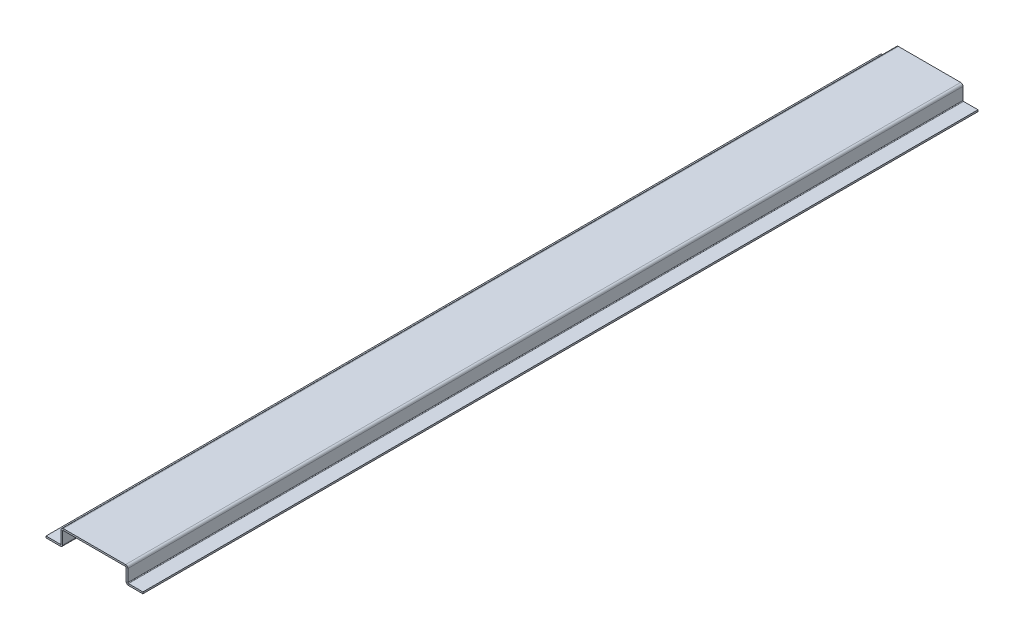
ISO-10303-21;
HEADER;
FILE_DESCRIPTION(('STEP AP214'),'2;1');
FILE_NAME('part.step','',(''),(''),'','','');
FILE_SCHEMA(('AUTOMOTIVE_DESIGN { 1 0 10303 214 1 1 1 1 }'));
ENDSEC;
DATA;
#1=APPLICATION_CONTEXT('core data for automotive mechanical design processes');
#2=APPLICATION_PROTOCOL_DEFINITION('international standard','automotive_design',2000,#1);
#3=PRODUCT_CONTEXT('',#1,'mechanical');
#4=PRODUCT('Part','Part','',(#3));
#5=PRODUCT_RELATED_PRODUCT_CATEGORY('part','',(#4));
#6=PRODUCT_DEFINITION_FORMATION('','',#4);
#7=PRODUCT_DEFINITION_CONTEXT('part definition',#1,'design');
#8=PRODUCT_DEFINITION('design','',#6,#7);
#9=PRODUCT_DEFINITION_SHAPE('','',#8);
#10=(LENGTH_UNIT() NAMED_UNIT(*) SI_UNIT(.MILLI.,.METRE.));
#11=(NAMED_UNIT(*) PLANE_ANGLE_UNIT() SI_UNIT($,.RADIAN.));
#12=(NAMED_UNIT(*) SI_UNIT($,.STERADIAN.) SOLID_ANGLE_UNIT());
#13=UNCERTAINTY_MEASURE_WITH_UNIT(LENGTH_MEASURE(1.E-05),#10,'distance_accuracy_value','');
#14=(GEOMETRIC_REPRESENTATION_CONTEXT(3) GLOBAL_UNCERTAINTY_ASSIGNED_CONTEXT((#13)) GLOBAL_UNIT_ASSIGNED_CONTEXT((#10,
#11,#12)) REPRESENTATION_CONTEXT('',''));
#15=CARTESIAN_POINT('',(0.,0.,0.));
#16=DIRECTION('',(0.,0.,1.));
#17=DIRECTION('',(1.,0.,0.));
#18=AXIS2_PLACEMENT_3D('',#15,#16,#17);
#19=CARTESIAN_POINT('',(40.7366,-18.,-1000.));
#20=DIRECTION('',(0.,0.,-1.));
#21=DIRECTION('',(-1.,0.,0.));
#22=AXIS2_PLACEMENT_3D('',#19,#20,#21);
#23=PLANE('',#22);
#24=DIRECTION('',(0.,1.,0.));
#25=VECTOR('',#24,1.);
#26=CARTESIAN_POINT('',(40.7366,-18.,-1000.));
#27=LINE('',#26,#25);
#28=CARTESIAN_POINT('',(40.7366,-18.,-1000.));
#29=VERTEX_POINT('',#28);
#30=CARTESIAN_POINT('',(40.7366,-16.,-1000.));
#31=VERTEX_POINT('',#30);
#32=EDGE_CURVE('E11',#29,#31,#27,.T.);
#33=ORIENTED_EDGE('',*,*,#32,.F.);
#34=CARTESIAN_POINT('',(40.7366,-15.2634,-1000.));
#35=DIRECTION('',(0.,0.,1.));
#36=DIRECTION('',(1.,0.,0.));
#37=AXIS2_PLACEMENT_3D('',#34,#35,#36);
#38=CIRCLE('',#37,2.7366);
#39=CARTESIAN_POINT('',(38.,-15.2634,-1000.));
#40=VERTEX_POINT('',#39);
#41=EDGE_CURVE('E368',#29,#40,#38,.F.);
#42=ORIENTED_EDGE('',*,*,#41,.T.);
#43=DIRECTION('',(-1.,0.,0.));
#44=VECTOR('',#43,1.);
#45=CARTESIAN_POINT('',(40.,-15.2634,-1000.));
#46=LINE('',#45,#44);
#47=CARTESIAN_POINT('',(40.,-15.2634,-1000.));
#48=VERTEX_POINT('',#47);
#49=EDGE_CURVE('E45',#48,#40,#46,.T.);
#50=ORIENTED_EDGE('',*,*,#49,.F.);
#51=CARTESIAN_POINT('',(40.7366,-15.2634,-1000.));
#52=DIRECTION('',(0.,0.,1.));
#53=DIRECTION('',(1.,0.,0.));
#54=AXIS2_PLACEMENT_3D('',#51,#52,#53);
#55=CIRCLE('',#54,0.7366);
#56=EDGE_CURVE('E393',#31,#48,#55,.F.);
#57=ORIENTED_EDGE('',*,*,#56,.F.);
#58=EDGE_LOOP('',(#33,#42,#50,#57));
#59=FACE_BOUND('',#58,.T.);
#60=ADVANCED_FACE('F37',(#59),#23,.T.);
#61=CARTESIAN_POINT('',(40.,-15.2634,-1000.));
#62=DIRECTION('',(0.,0.,-1.));
#63=DIRECTION('',(-1.,0.,0.));
#64=AXIS2_PLACEMENT_3D('',#61,#62,#63);
#65=PLANE('',#64);
#66=DIRECTION('',(-1.,0.,0.));
#67=VECTOR('',#66,1.);
#68=CARTESIAN_POINT('',(38.,-18.,-1000.));
#69=LINE('',#68,#67);
#70=CARTESIAN_POINT('',(58.,-18.,-1000.));
#71=VERTEX_POINT('',#70);
#72=EDGE_CURVE('E372',#71,#29,#69,.T.);
#73=ORIENTED_EDGE('',*,*,#72,.T.);
#74=ORIENTED_EDGE('',*,*,#32,.T.);
#75=DIRECTION('',(-1.,0.,0.));
#76=VECTOR('',#75,1.);
#77=CARTESIAN_POINT('',(38.,-16.,-1000.));
#78=LINE('',#77,#76);
#79=CARTESIAN_POINT('',(58.,-16.,-1000.));
#80=VERTEX_POINT('',#79);
#81=EDGE_CURVE('E390',#80,#31,#78,.T.);
#82=ORIENTED_EDGE('',*,*,#81,.F.);
#83=DIRECTION('',(0.,-1.,0.));
#84=VECTOR('',#83,1.);
#85=CARTESIAN_POINT('',(58.,-16.,-1000.));
#86=LINE('',#85,#84);
#87=EDGE_CURVE('E388',#80,#71,#86,.T.);
#88=ORIENTED_EDGE('',*,*,#87,.T.);
#89=EDGE_LOOP('',(#73,#74,#82,#88));
#90=FACE_BOUND('',#89,.T.);
#91=ADVANCED_FACE('F418',(#90),#65,.T.);
#92=CARTESIAN_POINT('',(38.,-15.2634,0.));
#93=DIRECTION('',(0.,0.,1.));
#94=DIRECTION('',(1.,0.,0.));
#95=AXIS2_PLACEMENT_3D('',#92,#93,#94);
#96=PLANE('',#95);
#97=DIRECTION('',(1.,0.,0.));
#98=VECTOR('',#97,1.);
#99=CARTESIAN_POINT('',(38.,-15.2634,0.));
#100=LINE('',#99,#98);
#101=CARTESIAN_POINT('',(38.,-15.2634,0.));
#102=VERTEX_POINT('',#101);
#103=CARTESIAN_POINT('',(40.,-15.2634,0.));
#104=VERTEX_POINT('',#103);
#105=EDGE_CURVE('E352',#102,#104,#100,.T.);
#106=ORIENTED_EDGE('',*,*,#105,.F.);
#107=CARTESIAN_POINT('',(40.7366,-15.2634,0.));
#108=DIRECTION('',(0.,0.,1.));
#109=DIRECTION('',(1.,0.,0.));
#110=AXIS2_PLACEMENT_3D('',#107,#108,#109);
#111=CIRCLE('',#110,2.7366);
#112=CARTESIAN_POINT('',(40.7366,-18.,0.));
#113=VERTEX_POINT('',#112);
#114=EDGE_CURVE('E256',#113,#102,#111,.F.);
#115=ORIENTED_EDGE('',*,*,#114,.F.);
#116=DIRECTION('',(0.,-1.,0.));
#117=VECTOR('',#116,1.);
#118=CARTESIAN_POINT('',(40.7366,-16.,0.));
#119=LINE('',#118,#117);
#120=CARTESIAN_POINT('',(40.7366,-16.,0.));
#121=VERTEX_POINT('',#120);
#122=EDGE_CURVE('E350',#121,#113,#119,.T.);
#123=ORIENTED_EDGE('',*,*,#122,.F.);
#124=CARTESIAN_POINT('',(40.7366,-15.2634,0.));
#125=DIRECTION('',(0.,0.,1.));
#126=DIRECTION('',(1.,0.,0.));
#127=AXIS2_PLACEMENT_3D('',#124,#125,#126);
#128=CIRCLE('',#127,0.7366);
#129=EDGE_CURVE('E267',#121,#104,#128,.F.);
#130=ORIENTED_EDGE('',*,*,#129,.T.);
#131=EDGE_LOOP('',(#106,#115,#123,#130));
#132=FACE_BOUND('',#131,.T.);
#133=ADVANCED_FACE('F426',(#132),#96,.T.);
#134=CARTESIAN_POINT('',(40.7366,-16.,0.));
#135=DIRECTION('',(0.,0.,1.));
#136=DIRECTION('',(1.,0.,0.));
#137=AXIS2_PLACEMENT_3D('',#134,#135,#136);
#138=PLANE('',#137);
#139=DIRECTION('',(0.,1.,0.));
#140=VECTOR('',#139,1.);
#141=CARTESIAN_POINT('',(38.,0.,0.));
#142=LINE('',#141,#140);
#143=CARTESIAN_POINT('',(38.,-0.7366,0.));
#144=VERTEX_POINT('',#143);
#145=EDGE_CURVE('E253',#102,#144,#142,.T.);
#146=ORIENTED_EDGE('',*,*,#145,.F.);
#147=ORIENTED_EDGE('',*,*,#105,.T.);
#148=DIRECTION('',(0.,1.,0.));
#149=VECTOR('',#148,1.);
#150=CARTESIAN_POINT('',(40.,0.,0.));
#151=LINE('',#150,#149);
#152=CARTESIAN_POINT('',(40.,-0.7366,0.));
#153=VERTEX_POINT('',#152);
#154=EDGE_CURVE('E270',#104,#153,#151,.T.);
#155=ORIENTED_EDGE('',*,*,#154,.T.);
#156=DIRECTION('',(-1.,0.,0.));
#157=VECTOR('',#156,1.);
#158=CARTESIAN_POINT('',(40.,-0.7366,0.));
#159=LINE('',#158,#157);
#160=EDGE_CURVE('E342',#153,#144,#159,.T.);
#161=ORIENTED_EDGE('',*,*,#160,.T.);
#162=EDGE_LOOP('',(#146,#147,#155,#161));
#163=FACE_BOUND('',#162,.T.);
#164=ADVANCED_FACE('F428',(#163),#138,.T.);
#165=CARTESIAN_POINT('',(38.,-0.7366,-1000.));
#166=DIRECTION('',(0.,0.,-1.));
#167=DIRECTION('',(-1.,0.,0.));
#168=AXIS2_PLACEMENT_3D('',#165,#166,#167);
#169=PLANE('',#168);
#170=DIRECTION('',(1.,0.,0.));
#171=VECTOR('',#170,1.);
#172=CARTESIAN_POINT('',(38.,-0.7366,-1000.));
#173=LINE('',#172,#171);
#174=CARTESIAN_POINT('',(38.,-0.7366,-1000.));
#175=VERTEX_POINT('',#174);
#176=CARTESIAN_POINT('',(40.,-0.7366,-1000.));
#177=VERTEX_POINT('',#176);
#178=EDGE_CURVE('E348',#175,#177,#173,.T.);
#179=ORIENTED_EDGE('',*,*,#178,.F.);
#180=CARTESIAN_POINT('',(37.2634,-0.7366,-1000.));
#181=DIRECTION('',(0.,0.,-1.));
#182=DIRECTION('',(-1.,0.,0.));
#183=AXIS2_PLACEMENT_3D('',#180,#181,#182);
#184=CIRCLE('',#183,0.7366);
#185=CARTESIAN_POINT('',(37.2634,0.,-1000.));
#186=VERTEX_POINT('',#185);
#187=EDGE_CURVE('E380',#175,#186,#184,.F.);
#188=ORIENTED_EDGE('',*,*,#187,.T.);
#189=DIRECTION('',(0.,-1.,0.));
#190=VECTOR('',#189,1.);
#191=CARTESIAN_POINT('',(37.2634,2.,-1000.));
#192=LINE('',#191,#190);
#193=CARTESIAN_POINT('',(37.2634,2.,-1000.));
#194=VERTEX_POINT('',#193);
#195=EDGE_CURVE('E346',#194,#186,#192,.T.);
#196=ORIENTED_EDGE('',*,*,#195,.F.);
#197=CARTESIAN_POINT('',(37.2634,-0.7366,-1000.));
#198=DIRECTION('',(0.,0.,1.));
#199=DIRECTION('',(1.,0.,0.));
#200=AXIS2_PLACEMENT_3D('',#197,#198,#199);
#201=CIRCLE('',#200,2.7366);
#202=EDGE_CURVE('E224',#177,#194,#201,.T.);
#203=ORIENTED_EDGE('',*,*,#202,.F.);
#204=EDGE_LOOP('',(#179,#188,#196,#203));
#205=FACE_BOUND('',#204,.T.);
#206=ADVANCED_FACE('F404',(#205),#169,.T.);
#207=CARTESIAN_POINT('',(37.2634,2.,-1000.));
#208=DIRECTION('',(0.,0.,-1.));
#209=DIRECTION('',(-1.,0.,0.));
#210=AXIS2_PLACEMENT_3D('',#207,#208,#209);
#211=PLANE('',#210);
#212=DIRECTION('',(0.,1.,0.));
#213=VECTOR('',#212,1.);
#214=CARTESIAN_POINT('',(38.,0.,-1000.));
#215=LINE('',#214,#213);
#216=EDGE_CURVE('E359',#40,#175,#215,.T.);
#217=ORIENTED_EDGE('',*,*,#216,.T.);
#218=ORIENTED_EDGE('',*,*,#178,.T.);
#219=DIRECTION('',(0.,1.,0.));
#220=VECTOR('',#219,1.);
#221=CARTESIAN_POINT('',(40.,0.,-1000.));
#222=LINE('',#221,#220);
#223=EDGE_CURVE('E362',#48,#177,#222,.T.);
#224=ORIENTED_EDGE('',*,*,#223,.F.);
#225=ORIENTED_EDGE('',*,*,#49,.T.);
#226=EDGE_LOOP('',(#217,#218,#224,#225));
#227=FACE_BOUND('',#226,.T.);
#228=ADVANCED_FACE('F357',(#227),#211,.T.);
#229=CARTESIAN_POINT('',(37.2634,0.,0.));
#230=DIRECTION('',(0.,0.,1.));
#231=DIRECTION('',(1.,0.,0.));
#232=AXIS2_PLACEMENT_3D('',#229,#230,#231);
#233=PLANE('',#232);
#234=DIRECTION('',(0.,1.,0.));
#235=VECTOR('',#234,1.);
#236=CARTESIAN_POINT('',(37.2634,0.,0.));
#237=LINE('',#236,#235);
#238=CARTESIAN_POINT('',(37.2634,0.,0.));
#239=VERTEX_POINT('',#238);
#240=CARTESIAN_POINT('',(37.2634,2.,0.));
#241=VERTEX_POINT('',#240);
#242=EDGE_CURVE('E344',#239,#241,#237,.T.);
#243=ORIENTED_EDGE('',*,*,#242,.F.);
#244=CARTESIAN_POINT('',(37.2634,-0.7366,0.));
#245=DIRECTION('',(0.,0.,-1.));
#246=DIRECTION('',(-1.,0.,0.));
#247=AXIS2_PLACEMENT_3D('',#244,#245,#246);
#248=CIRCLE('',#247,0.7366);
#249=EDGE_CURVE('E250',#144,#239,#248,.F.);
#250=ORIENTED_EDGE('',*,*,#249,.F.);
#251=ORIENTED_EDGE('',*,*,#160,.F.);
#252=CARTESIAN_POINT('',(37.2634,-0.7366,0.));
#253=DIRECTION('',(0.,0.,1.));
#254=DIRECTION('',(1.,0.,0.));
#255=AXIS2_PLACEMENT_3D('',#252,#253,#254);
#256=CIRCLE('',#255,2.7366);
#257=EDGE_CURVE('E273',#153,#241,#256,.T.);
#258=ORIENTED_EDGE('',*,*,#257,.T.);
#259=EDGE_LOOP('',(#243,#250,#251,#258));
#260=FACE_BOUND('',#259,.T.);
#261=ADVANCED_FACE('F434',(#260),#233,.T.);
#262=CARTESIAN_POINT('',(40.,-0.7366,0.));
#263=DIRECTION('',(0.,0.,1.));
#264=DIRECTION('',(1.,0.,0.));
#265=AXIS2_PLACEMENT_3D('',#262,#263,#264);
#266=PLANE('',#265);
#267=DIRECTION('',(-1.,0.,0.));
#268=VECTOR('',#267,1.);
#269=CARTESIAN_POINT('',(-38.,0.,0.));
#270=LINE('',#269,#268);
#271=CARTESIAN_POINT('',(-37.2634,0.,0.));
#272=VERTEX_POINT('',#271);
#273=EDGE_CURVE('E247',#239,#272,#270,.T.);
#274=ORIENTED_EDGE('',*,*,#273,.F.);
#275=ORIENTED_EDGE('',*,*,#242,.T.);
#276=DIRECTION('',(1.,0.,0.));
#277=VECTOR('',#276,1.);
#278=CARTESIAN_POINT('',(-38.,2.,0.));
#279=LINE('',#278,#277);
#280=CARTESIAN_POINT('',(-37.2634,2.,0.));
#281=VERTEX_POINT('',#280);
#282=EDGE_CURVE('E276',#241,#281,#279,.F.);
#283=ORIENTED_EDGE('',*,*,#282,.T.);
#284=DIRECTION('',(0.,-1.,0.));
#285=VECTOR('',#284,1.);
#286=CARTESIAN_POINT('',(-37.2634,2.,0.));
#287=LINE('',#286,#285);
#288=EDGE_CURVE('E338',#281,#272,#287,.T.);
#289=ORIENTED_EDGE('',*,*,#288,.T.);
#290=EDGE_LOOP('',(#274,#275,#283,#289));
#291=FACE_BOUND('',#290,.T.);
#292=ADVANCED_FACE('F437',(#291),#266,.T.);
#293=CARTESIAN_POINT('',(-37.2634,0.,-1000.));
#294=DIRECTION('',(0.,0.,-1.));
#295=DIRECTION('',(-1.,0.,0.));
#296=AXIS2_PLACEMENT_3D('',#293,#294,#295);
#297=PLANE('',#296);
#298=DIRECTION('',(0.,1.,0.));
#299=VECTOR('',#298,1.);
#300=CARTESIAN_POINT('',(-37.2634,0.,-1000.));
#301=LINE('',#300,#299);
#302=CARTESIAN_POINT('',(-37.2634,0.,-1000.));
#303=VERTEX_POINT('',#302);
#304=CARTESIAN_POINT('',(-37.2634,2.,-1000.));
#305=VERTEX_POINT('',#304);
#306=EDGE_CURVE('E196',#303,#305,#301,.T.);
#307=ORIENTED_EDGE('',*,*,#306,.F.);
#308=CARTESIAN_POINT('',(-37.2634,-0.7366,-1000.));
#309=DIRECTION('',(0.,0.,-1.));
#310=DIRECTION('',(-1.,0.,0.));
#311=AXIS2_PLACEMENT_3D('',#308,#309,#310);
#312=CIRCLE('',#311,0.7366);
#313=CARTESIAN_POINT('',(-38.,-0.7366,-1000.));
#314=VERTEX_POINT('',#313);
#315=EDGE_CURVE('E191',#303,#314,#312,.F.);
#316=ORIENTED_EDGE('',*,*,#315,.T.);
#317=DIRECTION('',(1.,0.,0.));
#318=VECTOR('',#317,1.);
#319=CARTESIAN_POINT('',(-40.,-0.736600000000001,-1000.));
#320=LINE('',#319,#318);
#321=CARTESIAN_POINT('',(-40.,-0.736600000000001,-1000.));
#322=VERTEX_POINT('',#321);
#323=EDGE_CURVE('E184',#322,#314,#320,.T.);
#324=ORIENTED_EDGE('',*,*,#323,.F.);
#325=CARTESIAN_POINT('',(-37.2634,-0.7366,-1000.));
#326=DIRECTION('',(0.,0.,1.));
#327=DIRECTION('',(1.,0.,0.));
#328=AXIS2_PLACEMENT_3D('',#325,#326,#327);
#329=CIRCLE('',#328,2.7366);
#330=EDGE_CURVE('E188',#305,#322,#329,.T.);
#331=ORIENTED_EDGE('',*,*,#330,.F.);
#332=EDGE_LOOP('',(#307,#316,#324,#331));
#333=FACE_BOUND('',#332,.T.);
#334=ADVANCED_FACE('F186',(#333),#297,.T.);
#335=CARTESIAN_POINT('',(-40.,-0.736600000000001,-1000.));
#336=DIRECTION('',(0.,0.,-1.));
#337=DIRECTION('',(-1.,0.,0.));
#338=AXIS2_PLACEMENT_3D('',#335,#336,#337);
#339=PLANE('',#338);
#340=DIRECTION('',(-1.,0.,0.));
#341=VECTOR('',#340,1.);
#342=CARTESIAN_POINT('',(-38.,0.,-1000.));
#343=LINE('',#342,#341);
#344=EDGE_CURVE('E383',#186,#303,#343,.T.);
#345=ORIENTED_EDGE('',*,*,#344,.T.);
#346=ORIENTED_EDGE('',*,*,#306,.T.);
#347=DIRECTION('',(1.,0.,0.));
#348=VECTOR('',#347,1.);
#349=CARTESIAN_POINT('',(-38.,2.,-1000.));
#350=LINE('',#349,#348);
#351=EDGE_CURVE('E222',#194,#305,#350,.F.);
#352=ORIENTED_EDGE('',*,*,#351,.F.);
#353=ORIENTED_EDGE('',*,*,#195,.T.);
#354=EDGE_LOOP('',(#345,#346,#352,#353));
#355=FACE_BOUND('',#354,.T.);
#356=ADVANCED_FACE('F485',(#355),#339,.T.);
#357=CARTESIAN_POINT('',(-38.,-0.7366,0.));
#358=DIRECTION('',(0.,0.,1.));
#359=DIRECTION('',(1.,0.,0.));
#360=AXIS2_PLACEMENT_3D('',#357,#358,#359);
#361=PLANE('',#360);
#362=DIRECTION('',(-1.,0.,0.));
#363=VECTOR('',#362,1.);
#364=CARTESIAN_POINT('',(-38.,-0.7366,0.));
#365=LINE('',#364,#363);
#366=CARTESIAN_POINT('',(-38.,-0.7366,0.));
#367=VERTEX_POINT('',#366);
#368=CARTESIAN_POINT('',(-40.,-0.736600000000001,0.));
#369=VERTEX_POINT('',#368);
#370=EDGE_CURVE('E197',#367,#369,#365,.T.);
#371=ORIENTED_EDGE('',*,*,#370,.F.);
#372=CARTESIAN_POINT('',(-37.2634,-0.7366,0.));
#373=DIRECTION('',(0.,0.,-1.));
#374=DIRECTION('',(-1.,0.,0.));
#375=AXIS2_PLACEMENT_3D('',#372,#373,#374);
#376=CIRCLE('',#375,0.7366);
#377=EDGE_CURVE('E244',#272,#367,#376,.F.);
#378=ORIENTED_EDGE('',*,*,#377,.F.);
#379=ORIENTED_EDGE('',*,*,#288,.F.);
#380=CARTESIAN_POINT('',(-37.2634,-0.7366,0.));
#381=DIRECTION('',(0.,0.,1.));
#382=DIRECTION('',(1.,0.,0.));
#383=AXIS2_PLACEMENT_3D('',#380,#381,#382);
#384=CIRCLE('',#383,2.7366);
#385=EDGE_CURVE('E279',#281,#369,#384,.T.);
#386=ORIENTED_EDGE('',*,*,#385,.T.);
#387=EDGE_LOOP('',(#371,#378,#379,#386));
#388=FACE_BOUND('',#387,.T.);
#389=ADVANCED_FACE('F446',(#388),#361,.T.);
#390=CARTESIAN_POINT('',(-37.2634,2.,0.));
#391=DIRECTION('',(0.,0.,1.));
#392=DIRECTION('',(1.,0.,0.));
#393=AXIS2_PLACEMENT_3D('',#390,#391,#392);
#394=PLANE('',#393);
#395=DIRECTION('',(0.,-1.,0.));
#396=VECTOR('',#395,1.);
#397=CARTESIAN_POINT('',(-38.,0.,0.));
#398=LINE('',#397,#396);
#399=CARTESIAN_POINT('',(-38.,-15.2634,0.));
#400=VERTEX_POINT('',#399);
#401=EDGE_CURVE('E241',#367,#400,#398,.T.);
#402=ORIENTED_EDGE('',*,*,#401,.F.);
#403=ORIENTED_EDGE('',*,*,#370,.T.);
#404=DIRECTION('',(0.,-1.,0.));
#405=VECTOR('',#404,1.);
#406=CARTESIAN_POINT('',(-40.,0.,0.));
#407=LINE('',#406,#405);
#408=CARTESIAN_POINT('',(-40.,-15.2634,0.));
#409=VERTEX_POINT('',#408);
#410=EDGE_CURVE('E207',#369,#409,#407,.T.);
#411=ORIENTED_EDGE('',*,*,#410,.T.);
#412=DIRECTION('',(1.,0.,0.));
#413=VECTOR('',#412,1.);
#414=CARTESIAN_POINT('',(-40.,-15.2634,0.));
#415=LINE('',#414,#413);
#416=EDGE_CURVE('E118',#409,#400,#415,.T.);
#417=ORIENTED_EDGE('',*,*,#416,.T.);
#418=EDGE_LOOP('',(#402,#403,#411,#417));
#419=FACE_BOUND('',#418,.T.);
#420=ADVANCED_FACE('F449',(#419),#394,.T.);
#421=CARTESIAN_POINT('',(-38.,-15.2634,-1000.));
#422=DIRECTION('',(0.,0.,-1.));
#423=DIRECTION('',(-1.,0.,0.));
#424=AXIS2_PLACEMENT_3D('',#421,#422,#423);
#425=PLANE('',#424);
#426=DIRECTION('',(-1.,0.,0.));
#427=VECTOR('',#426,1.);
#428=CARTESIAN_POINT('',(-38.,-15.2634,-1000.));
#429=LINE('',#428,#427);
#430=CARTESIAN_POINT('',(-38.,-15.2634,-1000.));
#431=VERTEX_POINT('',#430);
#432=CARTESIAN_POINT('',(-40.,-15.2634,-1000.));
#433=VERTEX_POINT('',#432);
#434=EDGE_CURVE('E215',#431,#433,#429,.T.);
#435=ORIENTED_EDGE('',*,*,#434,.F.);
#436=CARTESIAN_POINT('',(-40.7366,-15.2634,-1000.));
#437=DIRECTION('',(0.,0.,1.));
#438=DIRECTION('',(1.,0.,0.));
#439=AXIS2_PLACEMENT_3D('',#436,#437,#438);
#440=CIRCLE('',#439,2.7366);
#441=CARTESIAN_POINT('',(-40.7366,-18.,-1000.));
#442=VERTEX_POINT('',#441);
#443=EDGE_CURVE('E459',#431,#442,#440,.F.);
#444=ORIENTED_EDGE('',*,*,#443,.T.);
#445=DIRECTION('',(0.,-1.,0.));
#446=VECTOR('',#445,1.);
#447=CARTESIAN_POINT('',(-40.7366,-16.,-1000.));
#448=LINE('',#447,#446);
#449=CARTESIAN_POINT('',(-40.7366,-16.,-1000.));
#450=VERTEX_POINT('',#449);
#451=EDGE_CURVE('E53',#450,#442,#448,.T.);
#452=ORIENTED_EDGE('',*,*,#451,.F.);
#453=CARTESIAN_POINT('',(-40.7366,-15.2634,-1000.));
#454=DIRECTION('',(0.,0.,1.));
#455=DIRECTION('',(1.,0.,0.));
#456=AXIS2_PLACEMENT_3D('',#453,#454,#455);
#457=CIRCLE('',#456,0.7366);
#458=EDGE_CURVE('E217',#433,#450,#457,.F.);
#459=ORIENTED_EDGE('',*,*,#458,.F.);
#460=EDGE_LOOP('',(#435,#444,#452,#459));
#461=FACE_BOUND('',#460,.T.);
#462=ADVANCED_FACE('F524',(#461),#425,.T.);
#463=CARTESIAN_POINT('',(-40.7366,-16.,-1000.));
#464=DIRECTION('',(0.,0.,-1.));
#465=DIRECTION('',(-1.,0.,0.));
#466=AXIS2_PLACEMENT_3D('',#463,#464,#465);
#467=PLANE('',#466);
#468=DIRECTION('',(0.,-1.,0.));
#469=VECTOR('',#468,1.);
#470=CARTESIAN_POINT('',(-38.,0.,-1000.));
#471=LINE('',#470,#469);
#472=EDGE_CURVE('E477',#314,#431,#471,.T.);
#473=ORIENTED_EDGE('',*,*,#472,.T.);
#474=ORIENTED_EDGE('',*,*,#434,.T.);
#475=DIRECTION('',(0.,-1.,0.));
#476=VECTOR('',#475,1.);
#477=CARTESIAN_POINT('',(-40.,0.,-1000.));
#478=LINE('',#477,#476);
#479=EDGE_CURVE('E205',#322,#433,#478,.T.);
#480=ORIENTED_EDGE('',*,*,#479,.F.);
#481=ORIENTED_EDGE('',*,*,#323,.T.);
#482=EDGE_LOOP('',(#473,#474,#480,#481));
#483=FACE_BOUND('',#482,.T.);
#484=ADVANCED_FACE('F214',(#483),#467,.T.);
#485=CARTESIAN_POINT('',(-40.7366,-18.,0.));
#486=DIRECTION('',(0.,0.,1.));
#487=DIRECTION('',(1.,0.,0.));
#488=AXIS2_PLACEMENT_3D('',#485,#486,#487);
#489=PLANE('',#488);
#490=DIRECTION('',(0.,1.,0.));
#491=VECTOR('',#490,1.);
#492=CARTESIAN_POINT('',(-40.7366,-18.,0.));
#493=LINE('',#492,#491);
#494=CARTESIAN_POINT('',(-40.7366,-18.,0.));
#495=VERTEX_POINT('',#494);
#496=CARTESIAN_POINT('',(-40.7366,-16.,0.));
#497=VERTEX_POINT('',#496);
#498=EDGE_CURVE('E125',#495,#497,#493,.T.);
#499=ORIENTED_EDGE('',*,*,#498,.F.);
#500=CARTESIAN_POINT('',(-40.7366,-15.2634,0.));
#501=DIRECTION('',(0.,0.,1.));
#502=DIRECTION('',(1.,0.,0.));
#503=AXIS2_PLACEMENT_3D('',#500,#501,#502);
#504=CIRCLE('',#503,2.7366);
#505=EDGE_CURVE('E238',#400,#495,#504,.F.);
#506=ORIENTED_EDGE('',*,*,#505,.F.);
#507=ORIENTED_EDGE('',*,*,#416,.F.);
#508=CARTESIAN_POINT('',(-40.7366,-15.2634,0.));
#509=DIRECTION('',(0.,0.,1.));
#510=DIRECTION('',(1.,0.,0.));
#511=AXIS2_PLACEMENT_3D('',#508,#509,#510);
#512=CIRCLE('',#511,0.7366);
#513=EDGE_CURVE('E282',#409,#497,#512,.F.);
#514=ORIENTED_EDGE('',*,*,#513,.T.);
#515=EDGE_LOOP('',(#499,#506,#507,#514));
#516=FACE_BOUND('',#515,.T.);
#517=ADVANCED_FACE('F460',(#516),#489,.T.);
#518=CARTESIAN_POINT('',(-40.,-15.2634,0.));
#519=DIRECTION('',(0.,0.,1.));
#520=DIRECTION('',(1.,0.,0.));
#521=AXIS2_PLACEMENT_3D('',#518,#519,#520);
#522=PLANE('',#521);
#523=DIRECTION('',(-1.,0.,0.));
#524=VECTOR('',#523,1.);
#525=CARTESIAN_POINT('',(-38.,-18.,0.));
#526=LINE('',#525,#524);
#527=CARTESIAN_POINT('',(-58.,-18.,0.));
#528=VERTEX_POINT('',#527);
#529=EDGE_CURVE('E236',#495,#528,#526,.T.);
#530=ORIENTED_EDGE('',*,*,#529,.F.);
#531=ORIENTED_EDGE('',*,*,#498,.T.);
#532=DIRECTION('',(-1.,0.,0.));
#533=VECTOR('',#532,1.);
#534=CARTESIAN_POINT('',(-38.,-16.,0.));
#535=LINE('',#534,#533);
#536=CARTESIAN_POINT('',(-58.,-16.,0.));
#537=VERTEX_POINT('',#536);
#538=EDGE_CURVE('E231',#497,#537,#535,.T.);
#539=ORIENTED_EDGE('',*,*,#538,.T.);
#540=DIRECTION('',(0.,1.,0.));
#541=VECTOR('',#540,1.);
#542=CARTESIAN_POINT('',(-58.,-18.,0.));
#543=LINE('',#542,#541);
#544=EDGE_CURVE('E233',#528,#537,#543,.T.);
#545=ORIENTED_EDGE('',*,*,#544,.F.);
#546=EDGE_LOOP('',(#530,#531,#539,#545));
#547=FACE_BOUND('',#546,.T.);
#548=ADVANCED_FACE('F468',(#547),#522,.T.);
#549=CARTESIAN_POINT('',(-38.,-16.,-1000.));
#550=DIRECTION('',(0.,1.,0.));
#551=DIRECTION('',(-1.,0.,0.));
#552=AXIS2_PLACEMENT_3D('',#549,#550,#551);
#553=PLANE('',#552);
#554=ORIENTED_EDGE('',*,*,#538,.F.);
#555=DIRECTION('',(0.,0.,1.));
#556=VECTOR('',#555,1.);
#557=CARTESIAN_POINT('',(-40.7366,-16.,-1000.));
#558=LINE('',#557,#556);
#559=EDGE_CURVE('E285',#450,#497,#558,.T.);
#560=ORIENTED_EDGE('',*,*,#559,.F.);
#561=DIRECTION('',(-1.,0.,0.));
#562=VECTOR('',#561,1.);
#563=CARTESIAN_POINT('',(-38.,-16.,-1000.));
#564=LINE('',#563,#562);
#565=CARTESIAN_POINT('',(-58.,-16.,-1000.));
#566=VERTEX_POINT('',#565);
#567=EDGE_CURVE('E284',#450,#566,#564,.T.);
#568=ORIENTED_EDGE('',*,*,#567,.T.);
#569=DIRECTION('',(0.,0.,1.));
#570=VECTOR('',#569,1.);
#571=CARTESIAN_POINT('',(-58.,-16.,-1000.));
#572=LINE('',#571,#570);
#573=EDGE_CURVE('E230',#566,#537,#572,.T.);
#574=ORIENTED_EDGE('',*,*,#573,.T.);
#575=EDGE_LOOP('',(#554,#560,#568,#574));
#576=FACE_BOUND('',#575,.T.);
#577=ADVANCED_FACE('F466',(#576),#553,.T.);
#578=CARTESIAN_POINT('',(-40.7366,-15.2634,-1000.));
#579=DIRECTION('',(0.,0.,1.));
#580=DIRECTION('',(1.,0.,0.));
#581=AXIS2_PLACEMENT_3D('',#578,#579,#580);
#582=CYLINDRICAL_SURFACE('',#581,0.7366);
#583=ORIENTED_EDGE('',*,*,#513,.F.);
#584=DIRECTION('',(0.,0.,1.));
#585=VECTOR('',#584,1.);
#586=CARTESIAN_POINT('',(-40.,-15.2634,-1000.));
#587=LINE('',#586,#585);
#588=EDGE_CURVE('E211',#433,#409,#587,.T.);
#589=ORIENTED_EDGE('',*,*,#588,.F.);
#590=ORIENTED_EDGE('',*,*,#458,.T.);
#591=ORIENTED_EDGE('',*,*,#559,.T.);
#592=EDGE_LOOP('',(#583,#589,#590,#591));
#593=FACE_BOUND('',#592,.T.);
#594=ADVANCED_FACE('F462',(#593),#582,.F.);
#595=CARTESIAN_POINT('',(-40.,0.,-1000.));
#596=DIRECTION('',(-1.,0.,0.));
#597=DIRECTION('',(0.,-1.,0.));
#598=AXIS2_PLACEMENT_3D('',#595,#596,#597);
#599=PLANE('',#598);
#600=ORIENTED_EDGE('',*,*,#410,.F.);
#601=DIRECTION('',(0.,0.,1.));
#602=VECTOR('',#601,1.);
#603=CARTESIAN_POINT('',(-40.,-0.736600000000001,-1000.));
#604=LINE('',#603,#602);
#605=EDGE_CURVE('E203',#322,#369,#604,.T.);
#606=ORIENTED_EDGE('',*,*,#605,.F.);
#607=ORIENTED_EDGE('',*,*,#479,.T.);
#608=ORIENTED_EDGE('',*,*,#588,.T.);
#609=EDGE_LOOP('',(#600,#606,#607,#608));
#610=FACE_BOUND('',#609,.T.);
#611=ADVANCED_FACE('F204',(#610),#599,.T.);
#612=CARTESIAN_POINT('',(-37.2634,-0.7366,-1000.));
#613=DIRECTION('',(0.,0.,1.));
#614=DIRECTION('',(1.,0.,0.));
#615=AXIS2_PLACEMENT_3D('',#612,#613,#614);
#616=CYLINDRICAL_SURFACE('',#615,2.7366);
#617=ORIENTED_EDGE('',*,*,#385,.F.);
#618=DIRECTION('',(0.,0.,1.));
#619=VECTOR('',#618,1.);
#620=CARTESIAN_POINT('',(-37.2634,2.,-1000.));
#621=LINE('',#620,#619);
#622=EDGE_CURVE('E212',#305,#281,#621,.T.);
#623=ORIENTED_EDGE('',*,*,#622,.F.);
#624=ORIENTED_EDGE('',*,*,#330,.T.);
#625=ORIENTED_EDGE('',*,*,#605,.T.);
#626=EDGE_LOOP('',(#617,#623,#624,#625));
#627=FACE_BOUND('',#626,.T.);
#628=ADVANCED_FACE('F220',(#627),#616,.T.);
#629=CARTESIAN_POINT('',(-38.,2.,-1000.));
#630=DIRECTION('',(0.,1.,0.));
#631=DIRECTION('',(0.,0.,1.));
#632=AXIS2_PLACEMENT_3D('',#629,#630,#631);
#633=PLANE('',#632);
#634=ORIENTED_EDGE('',*,*,#282,.F.);
#635=DIRECTION('',(0.,0.,1.));
#636=VECTOR('',#635,1.);
#637=CARTESIAN_POINT('',(37.2634,2.,-1000.));
#638=LINE('',#637,#636);
#639=EDGE_CURVE('E289',#194,#241,#638,.T.);
#640=ORIENTED_EDGE('',*,*,#639,.F.);
#641=ORIENTED_EDGE('',*,*,#351,.T.);
#642=ORIENTED_EDGE('',*,*,#622,.T.);
#643=EDGE_LOOP('',(#634,#640,#641,#642));
#644=FACE_BOUND('',#643,.T.);
#645=ADVANCED_FACE('F488',(#644),#633,.T.);
#646=CARTESIAN_POINT('',(37.2634,-0.7366,-1000.));
#647=DIRECTION('',(0.,0.,1.));
#648=DIRECTION('',(1.,0.,0.));
#649=AXIS2_PLACEMENT_3D('',#646,#647,#648);
#650=CYLINDRICAL_SURFACE('',#649,2.7366);
#651=ORIENTED_EDGE('',*,*,#257,.F.);
#652=DIRECTION('',(0.,0.,1.));
#653=VECTOR('',#652,1.);
#654=CARTESIAN_POINT('',(40.,-0.7366,-1000.));
#655=LINE('',#654,#653);
#656=EDGE_CURVE('E292',#177,#153,#655,.T.);
#657=ORIENTED_EDGE('',*,*,#656,.F.);
#658=ORIENTED_EDGE('',*,*,#202,.T.);
#659=ORIENTED_EDGE('',*,*,#639,.T.);
#660=EDGE_LOOP('',(#651,#657,#658,#659));
#661=FACE_BOUND('',#660,.T.);
#662=ADVANCED_FACE('F400',(#661),#650,.T.);
#663=CARTESIAN_POINT('',(40.,0.,-1000.));
#664=DIRECTION('',(1.,0.,0.));
#665=DIRECTION('',(0.,1.,0.));
#666=AXIS2_PLACEMENT_3D('',#663,#664,#665);
#667=PLANE('',#666);
#668=ORIENTED_EDGE('',*,*,#154,.F.);
#669=DIRECTION('',(0.,0.,1.));
#670=VECTOR('',#669,1.);
#671=CARTESIAN_POINT('',(40.,-15.2634,-1000.));
#672=LINE('',#671,#670);
#673=EDGE_CURVE('E295',#48,#104,#672,.T.);
#674=ORIENTED_EDGE('',*,*,#673,.F.);
#675=ORIENTED_EDGE('',*,*,#223,.T.);
#676=ORIENTED_EDGE('',*,*,#656,.T.);
#677=EDGE_LOOP('',(#668,#674,#675,#676));
#678=FACE_BOUND('',#677,.T.);
#679=ADVANCED_FACE('F407',(#678),#667,.T.);
#680=CARTESIAN_POINT('',(40.7366,-15.2634,-1000.));
#681=DIRECTION('',(0.,0.,1.));
#682=DIRECTION('',(1.,0.,0.));
#683=AXIS2_PLACEMENT_3D('',#680,#681,#682);
#684=CYLINDRICAL_SURFACE('',#683,0.7366);
#685=ORIENTED_EDGE('',*,*,#129,.F.);
#686=DIRECTION('',(0.,0.,1.));
#687=VECTOR('',#686,1.);
#688=CARTESIAN_POINT('',(40.7366,-16.,-1000.));
#689=LINE('',#688,#687);
#690=EDGE_CURVE('E298',#31,#121,#689,.T.);
#691=ORIENTED_EDGE('',*,*,#690,.F.);
#692=ORIENTED_EDGE('',*,*,#56,.T.);
#693=ORIENTED_EDGE('',*,*,#673,.T.);
#694=EDGE_LOOP('',(#685,#691,#692,#693));
#695=FACE_BOUND('',#694,.T.);
#696=ADVANCED_FACE('F410',(#695),#684,.F.);
#697=CARTESIAN_POINT('',(38.,-16.,-1000.));
#698=DIRECTION('',(0.,1.,0.));
#699=DIRECTION('',(-1.,0.,0.));
#700=AXIS2_PLACEMENT_3D('',#697,#698,#699);
#701=PLANE('',#700);
#702=DIRECTION('',(-1.,0.,0.));
#703=VECTOR('',#702,1.);
#704=CARTESIAN_POINT('',(38.,-16.,0.));
#705=LINE('',#704,#703);
#706=CARTESIAN_POINT('',(58.,-16.,0.));
#707=VERTEX_POINT('',#706);
#708=EDGE_CURVE('E264',#707,#121,#705,.T.);
#709=ORIENTED_EDGE('',*,*,#708,.F.);
#710=DIRECTION('',(0.,0.,1.));
#711=VECTOR('',#710,1.);
#712=CARTESIAN_POINT('',(58.,-16.,-1000.));
#713=LINE('',#712,#711);
#714=EDGE_CURVE('E301',#80,#707,#713,.T.);
#715=ORIENTED_EDGE('',*,*,#714,.F.);
#716=ORIENTED_EDGE('',*,*,#81,.T.);
#717=ORIENTED_EDGE('',*,*,#690,.T.);
#718=EDGE_LOOP('',(#709,#715,#716,#717));
#719=FACE_BOUND('',#718,.T.);
#720=ADVANCED_FACE('F415',(#719),#701,.T.);
#721=CARTESIAN_POINT('',(58.,-16.,-1000.));
#722=DIRECTION('',(-1.,0.,0.));
#723=DIRECTION('',(0.,0.,1.));
#724=AXIS2_PLACEMENT_3D('',#721,#722,#723);
#725=PLANE('',#724);
#726=DIRECTION('',(0.,-1.,0.));
#727=VECTOR('',#726,1.);
#728=CARTESIAN_POINT('',(58.,-16.,0.));
#729=LINE('',#728,#727);
#730=CARTESIAN_POINT('',(58.,-18.,0.));
#731=VERTEX_POINT('',#730);
#732=EDGE_CURVE('E262',#707,#731,#729,.T.);
#733=ORIENTED_EDGE('',*,*,#732,.T.);
#734=DIRECTION('',(0.,0.,1.));
#735=VECTOR('',#734,1.);
#736=CARTESIAN_POINT('',(58.,-18.,-1000.));
#737=LINE('',#736,#735);
#738=EDGE_CURVE('E303',#71,#731,#737,.T.);
#739=ORIENTED_EDGE('',*,*,#738,.F.);
#740=ORIENTED_EDGE('',*,*,#87,.F.);
#741=ORIENTED_EDGE('',*,*,#714,.T.);
#742=EDGE_LOOP('',(#733,#739,#740,#741));
#743=FACE_BOUND('',#742,.T.);
#744=ADVANCED_FACE('F556',(#743),#725,.F.);
#745=CARTESIAN_POINT('',(38.,-18.,-1000.));
#746=DIRECTION('',(0.,1.,0.));
#747=DIRECTION('',(-1.,0.,0.));
#748=AXIS2_PLACEMENT_3D('',#745,#746,#747);
#749=PLANE('',#748);
#750=DIRECTION('',(-1.,0.,0.));
#751=VECTOR('',#750,1.);
#752=CARTESIAN_POINT('',(38.,-18.,0.));
#753=LINE('',#752,#751);
#754=EDGE_CURVE('E259',#731,#113,#753,.T.);
#755=ORIENTED_EDGE('',*,*,#754,.T.);
#756=DIRECTION('',(0.,0.,1.));
#757=VECTOR('',#756,1.);
#758=CARTESIAN_POINT('',(40.7366,-18.,-1000.));
#759=LINE('',#758,#757);
#760=EDGE_CURVE('E306',#29,#113,#759,.T.);
#761=ORIENTED_EDGE('',*,*,#760,.F.);
#762=ORIENTED_EDGE('',*,*,#72,.F.);
#763=ORIENTED_EDGE('',*,*,#738,.T.);
#764=EDGE_LOOP('',(#755,#761,#762,#763));
#765=FACE_BOUND('',#764,.T.);
#766=ADVANCED_FACE('F423',(#765),#749,.F.);
#767=CARTESIAN_POINT('',(40.7366,-15.2634,-1000.));
#768=DIRECTION('',(0.,0.,1.));
#769=DIRECTION('',(1.,0.,0.));
#770=AXIS2_PLACEMENT_3D('',#767,#768,#769);
#771=CYLINDRICAL_SURFACE('',#770,2.7366);
#772=ORIENTED_EDGE('',*,*,#114,.T.);
#773=DIRECTION('',(0.,0.,1.));
#774=VECTOR('',#773,1.);
#775=CARTESIAN_POINT('',(38.,-15.2634,-1000.));
#776=LINE('',#775,#774);
#777=EDGE_CURVE('E309',#40,#102,#776,.T.);
#778=ORIENTED_EDGE('',*,*,#777,.F.);
#779=ORIENTED_EDGE('',*,*,#41,.F.);
#780=ORIENTED_EDGE('',*,*,#760,.T.);
#781=EDGE_LOOP('',(#772,#778,#779,#780));
#782=FACE_BOUND('',#781,.T.);
#783=ADVANCED_FACE('F374',(#782),#771,.T.);
#784=CARTESIAN_POINT('',(38.,0.,-1000.));
#785=DIRECTION('',(1.,0.,0.));
#786=DIRECTION('',(0.,1.,0.));
#787=AXIS2_PLACEMENT_3D('',#784,#785,#786);
#788=PLANE('',#787);
#789=ORIENTED_EDGE('',*,*,#145,.T.);
#790=DIRECTION('',(0.,0.,1.));
#791=VECTOR('',#790,1.);
#792=CARTESIAN_POINT('',(38.,-0.7366,-1000.));
#793=LINE('',#792,#791);
#794=EDGE_CURVE('E312',#175,#144,#793,.T.);
#795=ORIENTED_EDGE('',*,*,#794,.F.);
#796=ORIENTED_EDGE('',*,*,#216,.F.);
#797=ORIENTED_EDGE('',*,*,#777,.T.);
#798=EDGE_LOOP('',(#789,#795,#796,#797));
#799=FACE_BOUND('',#798,.T.);
#800=ADVANCED_FACE('F378',(#799),#788,.F.);
#801=CARTESIAN_POINT('',(37.2634,-0.7366,-1000.));
#802=DIRECTION('',(0.,0.,1.));
#803=DIRECTION('',(1.,0.,0.));
#804=AXIS2_PLACEMENT_3D('',#801,#802,#803);
#805=CYLINDRICAL_SURFACE('',#804,0.7366);
#806=ORIENTED_EDGE('',*,*,#249,.T.);
#807=DIRECTION('',(0.,0.,1.));
#808=VECTOR('',#807,1.);
#809=CARTESIAN_POINT('',(37.2634,0.,-1000.));
#810=LINE('',#809,#808);
#811=EDGE_CURVE('E315',#186,#239,#810,.T.);
#812=ORIENTED_EDGE('',*,*,#811,.F.);
#813=ORIENTED_EDGE('',*,*,#187,.F.);
#814=ORIENTED_EDGE('',*,*,#794,.T.);
#815=EDGE_LOOP('',(#806,#812,#813,#814));
#816=FACE_BOUND('',#815,.T.);
#817=ADVANCED_FACE('F431',(#816),#805,.F.);
#818=CARTESIAN_POINT('',(-38.,0.,-1000.));
#819=DIRECTION('',(0.,1.,0.));
#820=DIRECTION('',(0.,0.,1.));
#821=AXIS2_PLACEMENT_3D('',#818,#819,#820);
#822=PLANE('',#821);
#823=ORIENTED_EDGE('',*,*,#273,.T.);
#824=DIRECTION('',(0.,0.,1.));
#825=VECTOR('',#824,1.);
#826=CARTESIAN_POINT('',(-37.2634,0.,-1000.));
#827=LINE('',#826,#825);
#828=EDGE_CURVE('E318',#303,#272,#827,.T.);
#829=ORIENTED_EDGE('',*,*,#828,.F.);
#830=ORIENTED_EDGE('',*,*,#344,.F.);
#831=ORIENTED_EDGE('',*,*,#811,.T.);
#832=EDGE_LOOP('',(#823,#829,#830,#831));
#833=FACE_BOUND('',#832,.T.);
#834=ADVANCED_FACE('F440',(#833),#822,.F.);
#835=CARTESIAN_POINT('',(-37.2634,-0.7366,-1000.));
#836=DIRECTION('',(0.,0.,1.));
#837=DIRECTION('',(1.,0.,0.));
#838=AXIS2_PLACEMENT_3D('',#835,#836,#837);
#839=CYLINDRICAL_SURFACE('',#838,0.7366);
#840=ORIENTED_EDGE('',*,*,#377,.T.);
#841=DIRECTION('',(0.,0.,1.));
#842=VECTOR('',#841,1.);
#843=CARTESIAN_POINT('',(-38.,-0.7366,-1000.));
#844=LINE('',#843,#842);
#845=EDGE_CURVE('E321',#314,#367,#844,.T.);
#846=ORIENTED_EDGE('',*,*,#845,.F.);
#847=ORIENTED_EDGE('',*,*,#315,.F.);
#848=ORIENTED_EDGE('',*,*,#828,.T.);
#849=EDGE_LOOP('',(#840,#846,#847,#848));
#850=FACE_BOUND('',#849,.T.);
#851=ADVANCED_FACE('F444',(#850),#839,.F.);
#852=CARTESIAN_POINT('',(-38.,0.,-1000.));
#853=DIRECTION('',(-1.,0.,0.));
#854=DIRECTION('',(0.,-1.,0.));
#855=AXIS2_PLACEMENT_3D('',#852,#853,#854);
#856=PLANE('',#855);
#857=ORIENTED_EDGE('',*,*,#401,.T.);
#858=DIRECTION('',(0.,0.,1.));
#859=VECTOR('',#858,1.);
#860=CARTESIAN_POINT('',(-38.,-15.2634,-1000.));
#861=LINE('',#860,#859);
#862=EDGE_CURVE('E324',#431,#400,#861,.T.);
#863=ORIENTED_EDGE('',*,*,#862,.F.);
#864=ORIENTED_EDGE('',*,*,#472,.F.);
#865=ORIENTED_EDGE('',*,*,#845,.T.);
#866=EDGE_LOOP('',(#857,#863,#864,#865));
#867=FACE_BOUND('',#866,.T.);
#868=ADVANCED_FACE('F453',(#867),#856,.F.);
#869=CARTESIAN_POINT('',(-40.7366,-15.2634,-1000.));
#870=DIRECTION('',(0.,0.,1.));
#871=DIRECTION('',(1.,0.,0.));
#872=AXIS2_PLACEMENT_3D('',#869,#870,#871);
#873=CYLINDRICAL_SURFACE('',#872,2.7366);
#874=ORIENTED_EDGE('',*,*,#505,.T.);
#875=DIRECTION('',(0.,0.,1.));
#876=VECTOR('',#875,1.);
#877=CARTESIAN_POINT('',(-40.7366,-18.,-1000.));
#878=LINE('',#877,#876);
#879=EDGE_CURVE('E327',#442,#495,#878,.T.);
#880=ORIENTED_EDGE('',*,*,#879,.F.);
#881=ORIENTED_EDGE('',*,*,#443,.F.);
#882=ORIENTED_EDGE('',*,*,#862,.T.);
#883=EDGE_LOOP('',(#874,#880,#881,#882));
#884=FACE_BOUND('',#883,.T.);
#885=ADVANCED_FACE('F457',(#884),#873,.T.);
#886=CARTESIAN_POINT('',(-38.,-18.,-1000.));
#887=DIRECTION('',(0.,1.,0.));
#888=DIRECTION('',(-1.,0.,0.));
#889=AXIS2_PLACEMENT_3D('',#886,#887,#888);
#890=PLANE('',#889);
#891=ORIENTED_EDGE('',*,*,#529,.T.);
#892=DIRECTION('',(0.,0.,1.));
#893=VECTOR('',#892,1.);
#894=CARTESIAN_POINT('',(-58.,-18.,-1000.));
#895=LINE('',#894,#893);
#896=CARTESIAN_POINT('',(-58.,-18.,-1000.));
#897=VERTEX_POINT('',#896);
#898=EDGE_CURVE('E330',#897,#528,#895,.T.);
#899=ORIENTED_EDGE('',*,*,#898,.F.);
#900=DIRECTION('',(-1.,0.,0.));
#901=VECTOR('',#900,1.);
#902=CARTESIAN_POINT('',(-38.,-18.,-1000.));
#903=LINE('',#902,#901);
#904=EDGE_CURVE('E475',#442,#897,#903,.T.);
#905=ORIENTED_EDGE('',*,*,#904,.F.);
#906=ORIENTED_EDGE('',*,*,#879,.T.);
#907=EDGE_LOOP('',(#891,#899,#905,#906));
#908=FACE_BOUND('',#907,.T.);
#909=ADVANCED_FACE('F474',(#908),#890,.F.);
#910=CARTESIAN_POINT('',(-58.,-18.,-1000.));
#911=DIRECTION('',(1.,0.,0.));
#912=DIRECTION('',(0.,0.,-1.));
#913=AXIS2_PLACEMENT_3D('',#910,#911,#912);
#914=PLANE('',#913);
#915=ORIENTED_EDGE('',*,*,#544,.T.);
#916=ORIENTED_EDGE('',*,*,#573,.F.);
#917=DIRECTION('',(0.,1.,0.));
#918=VECTOR('',#917,1.);
#919=CARTESIAN_POINT('',(-58.,-18.,-1000.));
#920=LINE('',#919,#918);
#921=EDGE_CURVE('E134',#897,#566,#920,.T.);
#922=ORIENTED_EDGE('',*,*,#921,.F.);
#923=ORIENTED_EDGE('',*,*,#898,.T.);
#924=EDGE_LOOP('',(#915,#916,#922,#923));
#925=FACE_BOUND('',#924,.T.);
#926=ADVANCED_FACE('F470',(#925),#914,.F.);
#927=CARTESIAN_POINT('',(-40.7366,-15.2634,-1000.));
#928=DIRECTION('',(0.,0.,1.));
#929=DIRECTION('',(1.,0.,0.));
#930=AXIS2_PLACEMENT_3D('',#927,#928,#929);
#931=PLANE('',#930);
#932=ORIENTED_EDGE('',*,*,#567,.F.);
#933=ORIENTED_EDGE('',*,*,#451,.T.);
#934=ORIENTED_EDGE('',*,*,#904,.T.);
#935=ORIENTED_EDGE('',*,*,#921,.T.);
#936=EDGE_LOOP('',(#932,#933,#934,#935));
#937=FACE_BOUND('',#936,.T.);
#938=ADVANCED_FACE('F537',(#937),#931,.F.);
#939=CARTESIAN_POINT('',(-40.7366,-15.2634,0.));
#940=DIRECTION('',(0.,0.,1.));
#941=DIRECTION('',(1.,0.,0.));
#942=AXIS2_PLACEMENT_3D('',#939,#940,#941);
#943=PLANE('',#942);
#944=ORIENTED_EDGE('',*,*,#708,.T.);
#945=ORIENTED_EDGE('',*,*,#122,.T.);
#946=ORIENTED_EDGE('',*,*,#754,.F.);
#947=ORIENTED_EDGE('',*,*,#732,.F.);
#948=EDGE_LOOP('',(#944,#945,#946,#947));
#949=FACE_BOUND('',#948,.T.);
#950=ADVANCED_FACE('F627',(#949),#943,.T.);
#951=CLOSED_SHELL('',(#60,#91,#133,#164,#206,#228,#261,#292,#334,#356,#389,#420,#462,#484,#517,
#548,#577,#594,#611,#628,#645,#662,#679,#696,#720,#744,#766,#783,#800,#817,#834,#851,#868,#885,
#909,#926,#938,#950));
#952=MANIFOLD_SOLID_BREP('B2',#951);
#953=ADVANCED_BREP_SHAPE_REPRESENTATION('',(#18,#952),#14);
#954=SHAPE_DEFINITION_REPRESENTATION(#9,#953);
ENDSEC;
END-ISO-10303-21;
